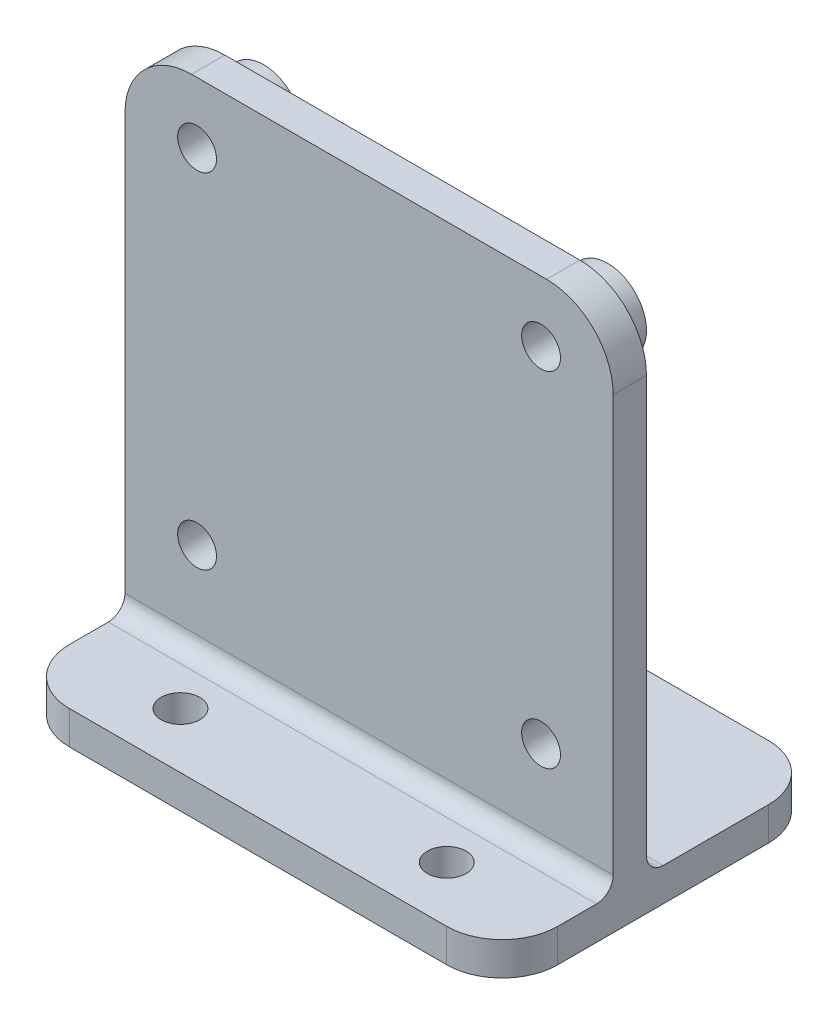
ISO-10303-21;
HEADER;
FILE_DESCRIPTION(('STEP AP214'),'2;1');
FILE_NAME('part.step','',(''),(''),'','','');
FILE_SCHEMA(('AUTOMOTIVE_DESIGN { 1 0 10303 214 1 1 1 1 }'));
ENDSEC;
DATA;
#1=APPLICATION_CONTEXT('core data for automotive mechanical design processes');
#2=APPLICATION_PROTOCOL_DEFINITION('international standard','automotive_design',2000,#1);
#3=PRODUCT_CONTEXT('',#1,'mechanical');
#4=PRODUCT('Part','Part','',(#3));
#5=PRODUCT_RELATED_PRODUCT_CATEGORY('part','',(#4));
#6=PRODUCT_DEFINITION_FORMATION('','',#4);
#7=PRODUCT_DEFINITION_CONTEXT('part definition',#1,'design');
#8=PRODUCT_DEFINITION('design','',#6,#7);
#9=PRODUCT_DEFINITION_SHAPE('','',#8);
#10=(LENGTH_UNIT() NAMED_UNIT(*) SI_UNIT(.MILLI.,.METRE.));
#11=(NAMED_UNIT(*) PLANE_ANGLE_UNIT() SI_UNIT($,.RADIAN.));
#12=(NAMED_UNIT(*) SI_UNIT($,.STERADIAN.) SOLID_ANGLE_UNIT());
#13=UNCERTAINTY_MEASURE_WITH_UNIT(LENGTH_MEASURE(1.E-05),#10,'distance_accuracy_value','');
#14=(GEOMETRIC_REPRESENTATION_CONTEXT(3) GLOBAL_UNCERTAINTY_ASSIGNED_CONTEXT((#13)) GLOBAL_UNIT_ASSIGNED_CONTEXT((#10,
#11,#12)) REPRESENTATION_CONTEXT('',''));
#15=CARTESIAN_POINT('',(0.,0.,0.));
#16=DIRECTION('',(0.,0.,1.));
#17=DIRECTION('',(1.,0.,0.));
#18=AXIS2_PLACEMENT_3D('',#15,#16,#17);
#19=CARTESIAN_POINT('',(22.,48.,-1.5));
#20=DIRECTION('',(0.,0.,1.));
#21=DIRECTION('',(0.,-1.,0.));
#22=AXIS2_PLACEMENT_3D('',#19,#20,#21);
#23=PLANE('',#22);
#24=CARTESIAN_POINT('',(-15.5,42.5,-1.5));
#25=DIRECTION('',(0.,0.,1.));
#26=DIRECTION('',(0.,1.,0.));
#27=AXIS2_PLACEMENT_3D('',#24,#25,#26);
#28=CIRCLE('',#27,3.5);
#29=CARTESIAN_POINT('',(-15.5,46.,-1.5));
#30=VERTEX_POINT('',#29);
#31=EDGE_CURVE('E479',#30,#30,#28,.T.);
#32=ORIENTED_EDGE('',*,*,#31,.T.);
#33=EDGE_LOOP('',(#32));
#34=FACE_BOUND('',#33,.T.);
#35=CARTESIAN_POINT('',(-15.5,11.5,-1.5));
#36=DIRECTION('',(0.,0.,1.));
#37=DIRECTION('',(0.,1.,0.));
#38=AXIS2_PLACEMENT_3D('',#35,#36,#37);
#39=CIRCLE('',#38,3.5);
#40=CARTESIAN_POINT('',(-15.5,15.,-1.5));
#41=VERTEX_POINT('',#40);
#42=EDGE_CURVE('E491',#41,#41,#39,.T.);
#43=ORIENTED_EDGE('',*,*,#42,.T.);
#44=EDGE_LOOP('',(#43));
#45=FACE_BOUND('',#44,.T.);
#46=CARTESIAN_POINT('',(15.5,11.5,-1.5));
#47=DIRECTION('',(0.,0.,1.));
#48=DIRECTION('',(0.,-1.,0.));
#49=AXIS2_PLACEMENT_3D('',#46,#47,#48);
#50=CIRCLE('',#49,3.5);
#51=CARTESIAN_POINT('',(15.5,8.,-1.5));
#52=VERTEX_POINT('',#51);
#53=EDGE_CURVE('E54',#52,#52,#50,.F.);
#54=ORIENTED_EDGE('',*,*,#53,.F.);
#55=EDGE_LOOP('',(#54));
#56=FACE_BOUND('',#55,.T.);
#57=DIRECTION('',(0.,1.,0.));
#58=VECTOR('',#57,1.);
#59=CARTESIAN_POINT('',(22.,48.,-1.5));
#60=LINE('',#59,#58);
#61=CARTESIAN_POINT('',(22.,4.50000000000001,-1.5));
#62=VERTEX_POINT('',#61);
#63=CARTESIAN_POINT('',(22.,42.,-1.5));
#64=VERTEX_POINT('',#63);
#65=EDGE_CURVE('E272',#62,#64,#60,.T.);
#66=ORIENTED_EDGE('',*,*,#65,.F.);
#67=DIRECTION('',(-1.,0.,0.));
#68=VECTOR('',#67,1.);
#69=CARTESIAN_POINT('',(-22.,4.5,-1.5));
#70=LINE('',#69,#68);
#71=CARTESIAN_POINT('',(-22.,4.50000000000001,-1.5));
#72=VERTEX_POINT('',#71);
#73=EDGE_CURVE('E253',#62,#72,#70,.T.);
#74=ORIENTED_EDGE('',*,*,#73,.T.);
#75=DIRECTION('',(0.,1.,0.));
#76=VECTOR('',#75,1.);
#77=CARTESIAN_POINT('',(-22.,48.,-1.5));
#78=LINE('',#77,#76);
#79=CARTESIAN_POINT('',(-22.,42.,-1.5));
#80=VERTEX_POINT('',#79);
#81=EDGE_CURVE('E397',#72,#80,#78,.T.);
#82=ORIENTED_EDGE('',*,*,#81,.T.);
#83=CARTESIAN_POINT('',(-16.,42.,-1.5));
#84=DIRECTION('',(0.,0.,1.));
#85=DIRECTION('',(0.,-1.,0.));
#86=AXIS2_PLACEMENT_3D('',#83,#84,#85);
#87=CIRCLE('',#86,6.);
#88=CARTESIAN_POINT('',(-16.,48.,-1.5));
#89=VERTEX_POINT('',#88);
#90=EDGE_CURVE('E204',#80,#89,#87,.F.);
#91=ORIENTED_EDGE('',*,*,#90,.T.);
#92=DIRECTION('',(-1.,0.,0.));
#93=VECTOR('',#92,1.);
#94=CARTESIAN_POINT('',(22.,48.,-1.5));
#95=LINE('',#94,#93);
#96=CARTESIAN_POINT('',(16.,48.,-1.5));
#97=VERTEX_POINT('',#96);
#98=EDGE_CURVE('E181',#97,#89,#95,.T.);
#99=ORIENTED_EDGE('',*,*,#98,.F.);
#100=CARTESIAN_POINT('',(16.,42.,-1.5));
#101=DIRECTION('',(0.,0.,1.));
#102=DIRECTION('',(0.,-1.,0.));
#103=AXIS2_PLACEMENT_3D('',#100,#101,#102);
#104=CIRCLE('',#103,6.);
#105=EDGE_CURVE('E186',#97,#64,#104,.F.);
#106=ORIENTED_EDGE('',*,*,#105,.T.);
#107=EDGE_LOOP('',(#66,#74,#82,#91,#99,#106));
#108=FACE_BOUND('',#107,.T.);
#109=CARTESIAN_POINT('',(15.5,42.5,-1.5));
#110=DIRECTION('',(0.,0.,1.));
#111=DIRECTION('',(0.,-1.,0.));
#112=AXIS2_PLACEMENT_3D('',#109,#110,#111);
#113=CIRCLE('',#112,3.5);
#114=CARTESIAN_POINT('',(15.5,39.,-1.5));
#115=VERTEX_POINT('',#114);
#116=EDGE_CURVE('E11',#115,#115,#113,.F.);
#117=ORIENTED_EDGE('',*,*,#116,.F.);
#118=EDGE_LOOP('',(#117));
#119=FACE_BOUND('',#118,.T.);
#120=ADVANCED_FACE('F50',(#34,#45,#56,#108,#119),#23,.F.);
#121=CARTESIAN_POINT('',(22.,3.,-17.5));
#122=DIRECTION('',(0.,0.,1.));
#123=DIRECTION('',(1.,0.,0.));
#124=AXIS2_PLACEMENT_3D('',#121,#122,#123);
#125=PLANE('',#124);
#126=DIRECTION('',(-1.,0.,0.));
#127=VECTOR('',#126,1.);
#128=CARTESIAN_POINT('',(22.,3.,-17.5));
#129=LINE('',#128,#127);
#130=CARTESIAN_POINT('',(17.,3.,-17.5));
#131=VERTEX_POINT('',#130);
#132=CARTESIAN_POINT('',(-17.,3.,-17.5));
#133=VERTEX_POINT('',#132);
#134=EDGE_CURVE('E188',#131,#133,#129,.T.);
#135=ORIENTED_EDGE('',*,*,#134,.F.);
#136=DIRECTION('',(0.,1.,0.));
#137=VECTOR('',#136,1.);
#138=CARTESIAN_POINT('',(17.,0.,-17.5));
#139=LINE('',#138,#137);
#140=CARTESIAN_POINT('',(17.,0.,-17.5));
#141=VERTEX_POINT('',#140);
#142=EDGE_CURVE('E222',#131,#141,#139,.F.);
#143=ORIENTED_EDGE('',*,*,#142,.T.);
#144=DIRECTION('',(-1.,0.,0.));
#145=VECTOR('',#144,1.);
#146=CARTESIAN_POINT('',(22.,0.,-17.5));
#147=LINE('',#146,#145);
#148=CARTESIAN_POINT('',(-17.,0.,-17.5));
#149=VERTEX_POINT('',#148);
#150=EDGE_CURVE('E395',#141,#149,#147,.T.);
#151=ORIENTED_EDGE('',*,*,#150,.T.);
#152=DIRECTION('',(0.,1.,0.));
#153=VECTOR('',#152,1.);
#154=CARTESIAN_POINT('',(-17.,3.,-17.5));
#155=LINE('',#154,#153);
#156=EDGE_CURVE('E217',#149,#133,#155,.T.);
#157=ORIENTED_EDGE('',*,*,#156,.T.);
#158=EDGE_LOOP('',(#135,#143,#151,#157));
#159=FACE_BOUND('',#158,.T.);
#160=ADVANCED_FACE('F268',(#159),#125,.F.);
#161=CARTESIAN_POINT('',(22.,3.,-1.5));
#162=DIRECTION('',(0.,-1.,0.));
#163=DIRECTION('',(0.,0.,-1.));
#164=AXIS2_PLACEMENT_3D('',#161,#162,#163);
#165=PLANE('',#164);
#166=DIRECTION('',(0.,0.,1.));
#167=VECTOR('',#166,1.);
#168=CARTESIAN_POINT('',(-22.,3.,-1.5));
#169=LINE('',#168,#167);
#170=CARTESIAN_POINT('',(-22.,3.,-12.5));
#171=VERTEX_POINT('',#170);
#172=CARTESIAN_POINT('',(-22.,3.,-3.));
#173=VERTEX_POINT('',#172);
#174=EDGE_CURVE('E396',#171,#173,#169,.T.);
#175=ORIENTED_EDGE('',*,*,#174,.T.);
#176=DIRECTION('',(-1.,0.,0.));
#177=VECTOR('',#176,1.);
#178=CARTESIAN_POINT('',(22.,3.,-3.));
#179=LINE('',#178,#177);
#180=CARTESIAN_POINT('',(22.,3.,-3.));
#181=VERTEX_POINT('',#180);
#182=EDGE_CURVE('E69',#173,#181,#179,.F.);
#183=ORIENTED_EDGE('',*,*,#182,.T.);
#184=DIRECTION('',(0.,0.,1.));
#185=VECTOR('',#184,1.);
#186=CARTESIAN_POINT('',(22.,3.,-1.5));
#187=LINE('',#186,#185);
#188=CARTESIAN_POINT('',(22.,3.,-12.5));
#189=VERTEX_POINT('',#188);
#190=EDGE_CURVE('E408',#189,#181,#187,.T.);
#191=ORIENTED_EDGE('',*,*,#190,.F.);
#192=CARTESIAN_POINT('',(17.,3.,-12.5));
#193=DIRECTION('',(0.,-1.,0.));
#194=DIRECTION('',(0.,0.,-1.));
#195=AXIS2_PLACEMENT_3D('',#192,#193,#194);
#196=CIRCLE('',#195,5.);
#197=EDGE_CURVE('E216',#189,#131,#196,.F.);
#198=ORIENTED_EDGE('',*,*,#197,.T.);
#199=ORIENTED_EDGE('',*,*,#134,.T.);
#200=CARTESIAN_POINT('',(-17.,3.,-12.5));
#201=DIRECTION('',(0.,-1.,0.));
#202=DIRECTION('',(0.,0.,-1.));
#203=AXIS2_PLACEMENT_3D('',#200,#201,#202);
#204=CIRCLE('',#203,5.);
#205=EDGE_CURVE('E212',#133,#171,#204,.F.);
#206=ORIENTED_EDGE('',*,*,#205,.T.);
#207=EDGE_LOOP('',(#175,#183,#191,#198,#199,#206));
#208=FACE_BOUND('',#207,.T.);
#209=ADVANCED_FACE('F347',(#208),#165,.F.);
#210=CARTESIAN_POINT('',(22.,48.,1.5));
#211=DIRECTION('',(0.,-1.,0.));
#212=DIRECTION('',(0.,0.,-1.));
#213=AXIS2_PLACEMENT_3D('',#210,#211,#212);
#214=PLANE('',#213);
#215=ORIENTED_EDGE('',*,*,#98,.T.);
#216=DIRECTION('',(0.,0.,1.));
#217=VECTOR('',#216,1.);
#218=CARTESIAN_POINT('',(-16.,48.,1.5));
#219=LINE('',#218,#217);
#220=CARTESIAN_POINT('',(-16.,48.,1.5));
#221=VERTEX_POINT('',#220);
#222=EDGE_CURVE('E171',#89,#221,#219,.T.);
#223=ORIENTED_EDGE('',*,*,#222,.T.);
#224=DIRECTION('',(-1.,0.,0.));
#225=VECTOR('',#224,1.);
#226=CARTESIAN_POINT('',(22.,48.,1.5));
#227=LINE('',#226,#225);
#228=CARTESIAN_POINT('',(16.,48.,1.5));
#229=VERTEX_POINT('',#228);
#230=EDGE_CURVE('E167',#229,#221,#227,.T.);
#231=ORIENTED_EDGE('',*,*,#230,.F.);
#232=DIRECTION('',(0.,0.,1.));
#233=VECTOR('',#232,1.);
#234=CARTESIAN_POINT('',(16.,48.,-1.5));
#235=LINE('',#234,#233);
#236=EDGE_CURVE('E177',#229,#97,#235,.F.);
#237=ORIENTED_EDGE('',*,*,#236,.T.);
#238=EDGE_LOOP('',(#215,#223,#231,#237));
#239=FACE_BOUND('',#238,.T.);
#240=ADVANCED_FACE('F179',(#239),#214,.F.);
#241=CARTESIAN_POINT('',(22.,3.,1.49999999999999));
#242=DIRECTION('',(0.,0.,-1.));
#243=DIRECTION('',(0.,1.,0.));
#244=AXIS2_PLACEMENT_3D('',#241,#242,#243);
#245=PLANE('',#244);
#246=CARTESIAN_POINT('',(15.5,42.5,1.5));
#247=DIRECTION('',(0.,0.,-1.));
#248=DIRECTION('',(0.,1.,0.));
#249=AXIS2_PLACEMENT_3D('',#246,#247,#248);
#250=CIRCLE('',#249,1.75);
#251=CARTESIAN_POINT('',(15.5,44.25,1.5));
#252=VERTEX_POINT('',#251);
#253=EDGE_CURVE('E198',#252,#252,#250,.F.);
#254=ORIENTED_EDGE('',*,*,#253,.F.);
#255=EDGE_LOOP('',(#254));
#256=FACE_BOUND('',#255,.T.);
#257=CARTESIAN_POINT('',(-15.5,11.5,1.49999999999999));
#258=DIRECTION('',(0.,0.,-1.));
#259=DIRECTION('',(0.,1.,0.));
#260=AXIS2_PLACEMENT_3D('',#257,#258,#259);
#261=CIRCLE('',#260,1.75);
#262=CARTESIAN_POINT('',(-15.5,13.25,1.49999999999999));
#263=VERTEX_POINT('',#262);
#264=EDGE_CURVE('E421',#263,#263,#261,.F.);
#265=ORIENTED_EDGE('',*,*,#264,.F.);
#266=EDGE_LOOP('',(#265));
#267=FACE_BOUND('',#266,.T.);
#268=CARTESIAN_POINT('',(-15.5,42.5,1.5));
#269=DIRECTION('',(0.,0.,-1.));
#270=DIRECTION('',(0.,1.,0.));
#271=AXIS2_PLACEMENT_3D('',#268,#269,#270);
#272=CIRCLE('',#271,1.75);
#273=CARTESIAN_POINT('',(-15.5,44.25,1.5));
#274=VERTEX_POINT('',#273);
#275=EDGE_CURVE('E402',#274,#274,#272,.T.);
#276=ORIENTED_EDGE('',*,*,#275,.T.);
#277=EDGE_LOOP('',(#276));
#278=FACE_BOUND('',#277,.T.);
#279=CARTESIAN_POINT('',(15.5,11.5,1.49999999999999));
#280=DIRECTION('',(0.,0.,-1.));
#281=DIRECTION('',(0.,1.,0.));
#282=AXIS2_PLACEMENT_3D('',#279,#280,#281);
#283=CIRCLE('',#282,1.75);
#284=CARTESIAN_POINT('',(15.5,13.25,1.49999999999999));
#285=VERTEX_POINT('',#284);
#286=EDGE_CURVE('E420',#285,#285,#283,.T.);
#287=ORIENTED_EDGE('',*,*,#286,.T.);
#288=EDGE_LOOP('',(#287));
#289=FACE_BOUND('',#288,.T.);
#290=DIRECTION('',(0.,-1.,0.));
#291=VECTOR('',#290,1.);
#292=CARTESIAN_POINT('',(-22.,3.,1.49999999999999));
#293=LINE('',#292,#291);
#294=CARTESIAN_POINT('',(-22.,42.,1.5));
#295=VERTEX_POINT('',#294);
#296=CARTESIAN_POINT('',(-22.,4.5,1.49999999999999));
#297=VERTEX_POINT('',#296);
#298=EDGE_CURVE('E401',#295,#297,#293,.T.);
#299=ORIENTED_EDGE('',*,*,#298,.T.);
#300=DIRECTION('',(-1.,0.,0.));
#301=VECTOR('',#300,1.);
#302=CARTESIAN_POINT('',(22.,4.5,1.49999999999999));
#303=LINE('',#302,#301);
#304=CARTESIAN_POINT('',(22.,4.5,1.49999999999999));
#305=VERTEX_POINT('',#304);
#306=EDGE_CURVE('E249',#297,#305,#303,.F.);
#307=ORIENTED_EDGE('',*,*,#306,.T.);
#308=DIRECTION('',(0.,-1.,0.));
#309=VECTOR('',#308,1.);
#310=CARTESIAN_POINT('',(22.,3.,1.49999999999999));
#311=LINE('',#310,#309);
#312=CARTESIAN_POINT('',(22.,42.,1.5));
#313=VERTEX_POINT('',#312);
#314=EDGE_CURVE('E169',#313,#305,#311,.T.);
#315=ORIENTED_EDGE('',*,*,#314,.F.);
#316=CARTESIAN_POINT('',(16.,42.,1.5));
#317=DIRECTION('',(0.,0.,-1.));
#318=DIRECTION('',(0.,1.,0.));
#319=AXIS2_PLACEMENT_3D('',#316,#317,#318);
#320=CIRCLE('',#319,6.);
#321=EDGE_CURVE('E165',#313,#229,#320,.F.);
#322=ORIENTED_EDGE('',*,*,#321,.T.);
#323=ORIENTED_EDGE('',*,*,#230,.T.);
#324=CARTESIAN_POINT('',(-16.,42.,1.5));
#325=DIRECTION('',(0.,0.,-1.));
#326=DIRECTION('',(0.,1.,0.));
#327=AXIS2_PLACEMENT_3D('',#324,#325,#326);
#328=CIRCLE('',#327,6.);
#329=EDGE_CURVE('E175',#221,#295,#328,.F.);
#330=ORIENTED_EDGE('',*,*,#329,.T.);
#331=EDGE_LOOP('',(#299,#307,#315,#322,#323,#330));
#332=FACE_BOUND('',#331,.T.);
#333=ADVANCED_FACE('F164',(#256,#267,#278,#289,#332),#245,.F.);
#334=CARTESIAN_POINT('',(22.,3.,11.5));
#335=DIRECTION('',(0.,-1.,0.));
#336=DIRECTION('',(0.,0.,-1.));
#337=AXIS2_PLACEMENT_3D('',#334,#335,#336);
#338=PLANE('',#337);
#339=CARTESIAN_POINT('',(-12.,3.,6.5));
#340=DIRECTION('',(0.,1.,0.));
#341=DIRECTION('',(0.,0.,1.));
#342=AXIS2_PLACEMENT_3D('',#339,#340,#341);
#343=CIRCLE('',#342,1.75);
#344=CARTESIAN_POINT('',(-12.,3.,8.25));
#345=VERTEX_POINT('',#344);
#346=EDGE_CURVE('E427',#345,#345,#343,.T.);
#347=ORIENTED_EDGE('',*,*,#346,.F.);
#348=EDGE_LOOP('',(#347));
#349=FACE_BOUND('',#348,.T.);
#350=CARTESIAN_POINT('',(12.,3.,6.5));
#351=DIRECTION('',(0.,1.,0.));
#352=DIRECTION('',(0.,0.,1.));
#353=AXIS2_PLACEMENT_3D('',#350,#351,#352);
#354=CIRCLE('',#353,1.75);
#355=CARTESIAN_POINT('',(12.,3.,8.25));
#356=VERTEX_POINT('',#355);
#357=EDGE_CURVE('E433',#356,#356,#354,.T.);
#358=ORIENTED_EDGE('',*,*,#357,.F.);
#359=EDGE_LOOP('',(#358));
#360=FACE_BOUND('',#359,.T.);
#361=DIRECTION('',(0.,0.,1.));
#362=VECTOR('',#361,1.);
#363=CARTESIAN_POINT('',(22.,3.,11.5));
#364=LINE('',#363,#362);
#365=CARTESIAN_POINT('',(22.,3.,2.99999999999999));
#366=VERTEX_POINT('',#365);
#367=CARTESIAN_POINT('',(22.,3.,6.5));
#368=VERTEX_POINT('',#367);
#369=EDGE_CURVE('E384',#366,#368,#364,.T.);
#370=ORIENTED_EDGE('',*,*,#369,.F.);
#371=DIRECTION('',(-1.,0.,0.));
#372=VECTOR('',#371,1.);
#373=CARTESIAN_POINT('',(-22.,3.,2.99999999999999));
#374=LINE('',#373,#372);
#375=CARTESIAN_POINT('',(-22.,3.,2.99999999999999));
#376=VERTEX_POINT('',#375);
#377=EDGE_CURVE('E248',#366,#376,#374,.T.);
#378=ORIENTED_EDGE('',*,*,#377,.T.);
#379=DIRECTION('',(0.,0.,1.));
#380=VECTOR('',#379,1.);
#381=CARTESIAN_POINT('',(-22.,3.,11.5));
#382=LINE('',#381,#380);
#383=CARTESIAN_POINT('',(-22.,3.,6.5));
#384=VERTEX_POINT('',#383);
#385=EDGE_CURVE('E403',#376,#384,#382,.T.);
#386=ORIENTED_EDGE('',*,*,#385,.T.);
#387=CARTESIAN_POINT('',(-17.,3.,6.5));
#388=DIRECTION('',(0.,-1.,0.));
#389=DIRECTION('',(0.,0.,-1.));
#390=AXIS2_PLACEMENT_3D('',#387,#388,#389);
#391=CIRCLE('',#390,5.);
#392=CARTESIAN_POINT('',(-17.,3.,11.5));
#393=VERTEX_POINT('',#392);
#394=EDGE_CURVE('E241',#384,#393,#391,.F.);
#395=ORIENTED_EDGE('',*,*,#394,.T.);
#396=DIRECTION('',(-1.,0.,0.));
#397=VECTOR('',#396,1.);
#398=CARTESIAN_POINT('',(22.,3.,11.5));
#399=LINE('',#398,#397);
#400=CARTESIAN_POINT('',(17.,3.,11.5));
#401=VERTEX_POINT('',#400);
#402=EDGE_CURVE('E184',#401,#393,#399,.T.);
#403=ORIENTED_EDGE('',*,*,#402,.F.);
#404=CARTESIAN_POINT('',(17.,3.,6.5));
#405=DIRECTION('',(0.,-1.,0.));
#406=DIRECTION('',(0.,0.,-1.));
#407=AXIS2_PLACEMENT_3D('',#404,#405,#406);
#408=CIRCLE('',#407,5.);
#409=EDGE_CURVE('E242',#401,#368,#408,.F.);
#410=ORIENTED_EDGE('',*,*,#409,.T.);
#411=EDGE_LOOP('',(#370,#378,#386,#395,#403,#410));
#412=FACE_BOUND('',#411,.T.);
#413=ADVANCED_FACE('F339',(#349,#360,#412),#338,.F.);
#414=CARTESIAN_POINT('',(22.,0.,11.5));
#415=DIRECTION('',(0.,0.,-1.));
#416=DIRECTION('',(-1.,0.,0.));
#417=AXIS2_PLACEMENT_3D('',#414,#415,#416);
#418=PLANE('',#417);
#419=ORIENTED_EDGE('',*,*,#402,.T.);
#420=DIRECTION('',(0.,-1.,0.));
#421=VECTOR('',#420,1.);
#422=CARTESIAN_POINT('',(-17.,0.,11.5));
#423=LINE('',#422,#421);
#424=CARTESIAN_POINT('',(-17.,0.,11.5));
#425=VERTEX_POINT('',#424);
#426=EDGE_CURVE('E236',#393,#425,#423,.T.);
#427=ORIENTED_EDGE('',*,*,#426,.T.);
#428=DIRECTION('',(-1.,0.,0.));
#429=VECTOR('',#428,1.);
#430=CARTESIAN_POINT('',(22.,0.,11.5));
#431=LINE('',#430,#429);
#432=CARTESIAN_POINT('',(17.,0.,11.5));
#433=VERTEX_POINT('',#432);
#434=EDGE_CURVE('E411',#433,#425,#431,.T.);
#435=ORIENTED_EDGE('',*,*,#434,.F.);
#436=DIRECTION('',(0.,-1.,0.));
#437=VECTOR('',#436,1.);
#438=CARTESIAN_POINT('',(17.,3.,11.5));
#439=LINE('',#438,#437);
#440=EDGE_CURVE('E237',#433,#401,#439,.F.);
#441=ORIENTED_EDGE('',*,*,#440,.T.);
#442=EDGE_LOOP('',(#419,#427,#435,#441));
#443=FACE_BOUND('',#442,.T.);
#444=ADVANCED_FACE('F334',(#443),#418,.F.);
#445=CARTESIAN_POINT('',(22.,0.,0.));
#446=DIRECTION('',(0.,1.,0.));
#447=DIRECTION('',(0.,0.,1.));
#448=AXIS2_PLACEMENT_3D('',#445,#446,#447);
#449=PLANE('',#448);
#450=CARTESIAN_POINT('',(-12.,0.,6.5));
#451=DIRECTION('',(0.,1.,0.));
#452=DIRECTION('',(0.,0.,1.));
#453=AXIS2_PLACEMENT_3D('',#450,#451,#452);
#454=CIRCLE('',#453,1.75);
#455=CARTESIAN_POINT('',(-12.,0.,8.25));
#456=VERTEX_POINT('',#455);
#457=EDGE_CURVE('E422',#456,#456,#454,.T.);
#458=ORIENTED_EDGE('',*,*,#457,.T.);
#459=EDGE_LOOP('',(#458));
#460=FACE_BOUND('',#459,.T.);
#461=CARTESIAN_POINT('',(12.,0.,6.5));
#462=DIRECTION('',(0.,1.,0.));
#463=DIRECTION('',(0.,0.,1.));
#464=AXIS2_PLACEMENT_3D('',#461,#462,#463);
#465=CIRCLE('',#464,1.75);
#466=CARTESIAN_POINT('',(12.,0.,8.25));
#467=VERTEX_POINT('',#466);
#468=EDGE_CURVE('E442',#467,#467,#465,.T.);
#469=ORIENTED_EDGE('',*,*,#468,.T.);
#470=EDGE_LOOP('',(#469));
#471=FACE_BOUND('',#470,.T.);
#472=ORIENTED_EDGE('',*,*,#150,.F.);
#473=CARTESIAN_POINT('',(17.,0.,-12.5));
#474=DIRECTION('',(0.,1.,0.));
#475=DIRECTION('',(0.,0.,1.));
#476=AXIS2_PLACEMENT_3D('',#473,#474,#475);
#477=CIRCLE('',#476,5.);
#478=CARTESIAN_POINT('',(22.,0.,-12.5));
#479=VERTEX_POINT('',#478);
#480=EDGE_CURVE('E226',#141,#479,#477,.F.);
#481=ORIENTED_EDGE('',*,*,#480,.T.);
#482=DIRECTION('',(0.,0.,-1.));
#483=VECTOR('',#482,1.);
#484=CARTESIAN_POINT('',(22.,0.,0.));
#485=LINE('',#484,#483);
#486=CARTESIAN_POINT('',(22.,0.,6.5));
#487=VERTEX_POINT('',#486);
#488=EDGE_CURVE('E392',#487,#479,#485,.T.);
#489=ORIENTED_EDGE('',*,*,#488,.F.);
#490=CARTESIAN_POINT('',(17.,0.,6.5));
#491=DIRECTION('',(0.,1.,0.));
#492=DIRECTION('',(0.,0.,1.));
#493=AXIS2_PLACEMENT_3D('',#490,#491,#492);
#494=CIRCLE('',#493,5.);
#495=EDGE_CURVE('E224',#487,#433,#494,.F.);
#496=ORIENTED_EDGE('',*,*,#495,.T.);
#497=ORIENTED_EDGE('',*,*,#434,.T.);
#498=CARTESIAN_POINT('',(-17.,0.,6.5));
#499=DIRECTION('',(0.,1.,0.));
#500=DIRECTION('',(0.,0.,1.));
#501=AXIS2_PLACEMENT_3D('',#498,#499,#500);
#502=CIRCLE('',#501,5.);
#503=CARTESIAN_POINT('',(-22.,0.,6.5));
#504=VERTEX_POINT('',#503);
#505=EDGE_CURVE('E223',#425,#504,#502,.F.);
#506=ORIENTED_EDGE('',*,*,#505,.T.);
#507=DIRECTION('',(0.,0.,-1.));
#508=VECTOR('',#507,1.);
#509=CARTESIAN_POINT('',(-22.,0.,0.));
#510=LINE('',#509,#508);
#511=CARTESIAN_POINT('',(-22.,0.,-12.5));
#512=VERTEX_POINT('',#511);
#513=EDGE_CURVE('E409',#504,#512,#510,.T.);
#514=ORIENTED_EDGE('',*,*,#513,.T.);
#515=CARTESIAN_POINT('',(-17.,0.,-12.5));
#516=DIRECTION('',(0.,1.,0.));
#517=DIRECTION('',(0.,0.,1.));
#518=AXIS2_PLACEMENT_3D('',#515,#516,#517);
#519=CIRCLE('',#518,5.);
#520=EDGE_CURVE('E229',#512,#149,#519,.F.);
#521=ORIENTED_EDGE('',*,*,#520,.T.);
#522=EDGE_LOOP('',(#472,#481,#489,#496,#497,#506,#514,#521));
#523=FACE_BOUND('',#522,.T.);
#524=ADVANCED_FACE('F330',(#460,#471,#523),#449,.F.);
#525=CARTESIAN_POINT('',(22.,0.,0.));
#526=DIRECTION('',(1.,0.,0.));
#527=DIRECTION('',(0.,0.,-1.));
#528=AXIS2_PLACEMENT_3D('',#525,#526,#527);
#529=PLANE('',#528);
#530=ORIENTED_EDGE('',*,*,#488,.T.);
#531=DIRECTION('',(0.,1.,0.));
#532=VECTOR('',#531,1.);
#533=CARTESIAN_POINT('',(22.,3.,-12.5));
#534=LINE('',#533,#532);
#535=EDGE_CURVE('E211',#479,#189,#534,.T.);
#536=ORIENTED_EDGE('',*,*,#535,.T.);
#537=ORIENTED_EDGE('',*,*,#190,.T.);
#538=CARTESIAN_POINT('',(22.,4.5,-3.));
#539=DIRECTION('',(1.,0.,0.));
#540=DIRECTION('',(0.,0.,-1.));
#541=AXIS2_PLACEMENT_3D('',#538,#539,#540);
#542=CIRCLE('',#541,1.5);
#543=EDGE_CURVE('E257',#181,#62,#542,.F.);
#544=ORIENTED_EDGE('',*,*,#543,.T.);
#545=ORIENTED_EDGE('',*,*,#65,.T.);
#546=DIRECTION('',(0.,0.,1.));
#547=VECTOR('',#546,1.);
#548=CARTESIAN_POINT('',(22.,42.,1.5));
#549=LINE('',#548,#547);
#550=EDGE_CURVE('E206',#64,#313,#549,.T.);
#551=ORIENTED_EDGE('',*,*,#550,.T.);
#552=ORIENTED_EDGE('',*,*,#314,.T.);
#553=CARTESIAN_POINT('',(22.,4.5,2.99999999999999));
#554=DIRECTION('',(1.,0.,0.));
#555=DIRECTION('',(0.,0.,-1.));
#556=AXIS2_PLACEMENT_3D('',#553,#554,#555);
#557=CIRCLE('',#556,1.5);
#558=EDGE_CURVE('E260',#305,#366,#557,.F.);
#559=ORIENTED_EDGE('',*,*,#558,.T.);
#560=ORIENTED_EDGE('',*,*,#369,.T.);
#561=DIRECTION('',(0.,-1.,0.));
#562=VECTOR('',#561,1.);
#563=CARTESIAN_POINT('',(22.,0.,6.5));
#564=LINE('',#563,#562);
#565=EDGE_CURVE('E208',#368,#487,#564,.T.);
#566=ORIENTED_EDGE('',*,*,#565,.T.);
#567=EDGE_LOOP('',(#530,#536,#537,#544,#545,#551,#552,#559,#560,#566));
#568=FACE_BOUND('',#567,.T.);
#569=ADVANCED_FACE('F322',(#568),#529,.T.);
#570=CARTESIAN_POINT('',(-22.,0.,0.));
#571=DIRECTION('',(1.,0.,0.));
#572=DIRECTION('',(0.,0.,-1.));
#573=AXIS2_PLACEMENT_3D('',#570,#571,#572);
#574=PLANE('',#573);
#575=ORIENTED_EDGE('',*,*,#174,.F.);
#576=DIRECTION('',(0.,1.,0.));
#577=VECTOR('',#576,1.);
#578=CARTESIAN_POINT('',(-22.,0.,-12.5));
#579=LINE('',#578,#577);
#580=EDGE_CURVE('E234',#171,#512,#579,.F.);
#581=ORIENTED_EDGE('',*,*,#580,.T.);
#582=ORIENTED_EDGE('',*,*,#513,.F.);
#583=DIRECTION('',(0.,-1.,0.));
#584=VECTOR('',#583,1.);
#585=CARTESIAN_POINT('',(-22.,0.,6.5));
#586=LINE('',#585,#584);
#587=EDGE_CURVE('E233',#504,#384,#586,.F.);
#588=ORIENTED_EDGE('',*,*,#587,.T.);
#589=ORIENTED_EDGE('',*,*,#385,.F.);
#590=CARTESIAN_POINT('',(-22.,4.5,2.99999999999999));
#591=DIRECTION('',(1.,0.,0.));
#592=DIRECTION('',(0.,0.,-1.));
#593=AXIS2_PLACEMENT_3D('',#590,#591,#592);
#594=CIRCLE('',#593,1.5);
#595=EDGE_CURVE('E254',#376,#297,#594,.T.);
#596=ORIENTED_EDGE('',*,*,#595,.T.);
#597=ORIENTED_EDGE('',*,*,#298,.F.);
#598=DIRECTION('',(0.,0.,1.));
#599=VECTOR('',#598,1.);
#600=CARTESIAN_POINT('',(-22.,42.,0.));
#601=LINE('',#600,#599);
#602=EDGE_CURVE('E199',#295,#80,#601,.F.);
#603=ORIENTED_EDGE('',*,*,#602,.T.);
#604=ORIENTED_EDGE('',*,*,#81,.F.);
#605=CARTESIAN_POINT('',(-22.,4.5,-3.));
#606=DIRECTION('',(1.,0.,0.));
#607=DIRECTION('',(0.,0.,-1.));
#608=AXIS2_PLACEMENT_3D('',#605,#606,#607);
#609=CIRCLE('',#608,1.5);
#610=EDGE_CURVE('E64',#72,#173,#609,.T.);
#611=ORIENTED_EDGE('',*,*,#610,.T.);
#612=EDGE_LOOP('',(#575,#581,#582,#588,#589,#596,#597,#603,#604,#611));
#613=FACE_BOUND('',#612,.T.);
#614=ADVANCED_FACE('F325',(#613),#574,.F.);
#615=CARTESIAN_POINT('',(15.5,11.5,11.5));
#616=DIRECTION('',(0.,0.,-1.));
#617=DIRECTION('',(0.,1.,0.));
#618=AXIS2_PLACEMENT_3D('',#615,#616,#617);
#619=CYLINDRICAL_SURFACE('',#618,1.75);
#620=ORIENTED_EDGE('',*,*,#286,.F.);
#621=EDGE_LOOP('',(#620));
#622=FACE_BOUND('',#621,.T.);
#623=CARTESIAN_POINT('',(15.5,11.5,-4.5));
#624=DIRECTION('',(0.,0.,-1.));
#625=DIRECTION('',(0.,1.,0.));
#626=AXIS2_PLACEMENT_3D('',#623,#624,#625);
#627=CIRCLE('',#626,1.75);
#628=CARTESIAN_POINT('',(15.5,13.25,-4.5));
#629=VERTEX_POINT('',#628);
#630=EDGE_CURVE('E436',#629,#629,#627,.T.);
#631=ORIENTED_EDGE('',*,*,#630,.T.);
#632=EDGE_LOOP('',(#631));
#633=FACE_BOUND('',#632,.T.);
#634=ADVANCED_FACE('F318',(#622,#633),#619,.F.);
#635=CARTESIAN_POINT('',(-15.5,42.5,11.5));
#636=DIRECTION('',(0.,0.,-1.));
#637=DIRECTION('',(0.,1.,0.));
#638=AXIS2_PLACEMENT_3D('',#635,#636,#637);
#639=CYLINDRICAL_SURFACE('',#638,1.75);
#640=ORIENTED_EDGE('',*,*,#275,.F.);
#641=EDGE_LOOP('',(#640));
#642=FACE_BOUND('',#641,.T.);
#643=CARTESIAN_POINT('',(-15.5,42.5,-4.5));
#644=DIRECTION('',(0.,0.,1.));
#645=DIRECTION('',(0.,1.,0.));
#646=AXIS2_PLACEMENT_3D('',#643,#644,#645);
#647=CIRCLE('',#646,1.75);
#648=CARTESIAN_POINT('',(-15.5,44.25,-4.5));
#649=VERTEX_POINT('',#648);
#650=EDGE_CURVE('E482',#649,#649,#647,.T.);
#651=ORIENTED_EDGE('',*,*,#650,.F.);
#652=EDGE_LOOP('',(#651));
#653=FACE_BOUND('',#652,.T.);
#654=ADVANCED_FACE('F314',(#642,#653),#639,.F.);
#655=CARTESIAN_POINT('',(-15.5,11.5,11.5));
#656=DIRECTION('',(0.,0.,-1.));
#657=DIRECTION('',(0.,1.,0.));
#658=AXIS2_PLACEMENT_3D('',#655,#656,#657);
#659=CYLINDRICAL_SURFACE('',#658,1.75);
#660=ORIENTED_EDGE('',*,*,#264,.T.);
#661=EDGE_LOOP('',(#660));
#662=FACE_BOUND('',#661,.T.);
#663=CARTESIAN_POINT('',(-15.5,11.5,-4.5));
#664=DIRECTION('',(0.,0.,1.));
#665=DIRECTION('',(0.,1.,0.));
#666=AXIS2_PLACEMENT_3D('',#663,#664,#665);
#667=CIRCLE('',#666,1.75);
#668=CARTESIAN_POINT('',(-15.5,13.25,-4.5));
#669=VERTEX_POINT('',#668);
#670=EDGE_CURVE('E488',#669,#669,#667,.T.);
#671=ORIENTED_EDGE('',*,*,#670,.F.);
#672=EDGE_LOOP('',(#671));
#673=FACE_BOUND('',#672,.T.);
#674=ADVANCED_FACE('F309',(#662,#673),#659,.F.);
#675=CARTESIAN_POINT('',(15.5,42.5,11.5));
#676=DIRECTION('',(0.,0.,-1.));
#677=DIRECTION('',(0.,1.,0.));
#678=AXIS2_PLACEMENT_3D('',#675,#676,#677);
#679=CYLINDRICAL_SURFACE('',#678,1.75);
#680=ORIENTED_EDGE('',*,*,#253,.T.);
#681=EDGE_LOOP('',(#680));
#682=FACE_BOUND('',#681,.T.);
#683=CARTESIAN_POINT('',(15.5,42.5,-4.5));
#684=DIRECTION('',(0.,0.,-1.));
#685=DIRECTION('',(0.,1.,0.));
#686=AXIS2_PLACEMENT_3D('',#683,#684,#685);
#687=CIRCLE('',#686,1.75);
#688=CARTESIAN_POINT('',(15.5,44.25,-4.5));
#689=VERTEX_POINT('',#688);
#690=EDGE_CURVE('E466',#689,#689,#687,.T.);
#691=ORIENTED_EDGE('',*,*,#690,.T.);
#692=EDGE_LOOP('',(#691));
#693=FACE_BOUND('',#692,.T.);
#694=ADVANCED_FACE('F308',(#682,#693),#679,.F.);
#695=CARTESIAN_POINT('',(12.,0.,6.5));
#696=DIRECTION('',(0.,1.,0.));
#697=DIRECTION('',(0.,0.,1.));
#698=AXIS2_PLACEMENT_3D('',#695,#696,#697);
#699=CYLINDRICAL_SURFACE('',#698,1.75);
#700=ORIENTED_EDGE('',*,*,#468,.F.);
#701=EDGE_LOOP('',(#700));
#702=FACE_BOUND('',#701,.T.);
#703=ORIENTED_EDGE('',*,*,#357,.T.);
#704=EDGE_LOOP('',(#703));
#705=FACE_BOUND('',#704,.T.);
#706=ADVANCED_FACE('F305',(#702,#705),#699,.F.);
#707=CARTESIAN_POINT('',(-12.,0.,6.5));
#708=DIRECTION('',(0.,1.,0.));
#709=DIRECTION('',(0.,0.,1.));
#710=AXIS2_PLACEMENT_3D('',#707,#708,#709);
#711=CYLINDRICAL_SURFACE('',#710,1.75);
#712=ORIENTED_EDGE('',*,*,#457,.F.);
#713=EDGE_LOOP('',(#712));
#714=FACE_BOUND('',#713,.T.);
#715=ORIENTED_EDGE('',*,*,#346,.T.);
#716=EDGE_LOOP('',(#715));
#717=FACE_BOUND('',#716,.T.);
#718=ADVANCED_FACE('F300',(#714,#717),#711,.F.);
#719=CARTESIAN_POINT('',(-16.,42.,1.5));
#720=DIRECTION('',(0.,0.,1.));
#721=DIRECTION('',(1.,0.,0.));
#722=AXIS2_PLACEMENT_3D('',#719,#720,#721);
#723=CYLINDRICAL_SURFACE('',#722,6.);
#724=ORIENTED_EDGE('',*,*,#90,.F.);
#725=ORIENTED_EDGE('',*,*,#602,.F.);
#726=ORIENTED_EDGE('',*,*,#329,.F.);
#727=ORIENTED_EDGE('',*,*,#222,.F.);
#728=EDGE_LOOP('',(#724,#725,#726,#727));
#729=FACE_BOUND('',#728,.T.);
#730=ADVANCED_FACE('F303',(#729),#723,.T.);
#731=CARTESIAN_POINT('',(16.,42.,0.));
#732=DIRECTION('',(0.,0.,-1.));
#733=DIRECTION('',(-1.,0.,0.));
#734=AXIS2_PLACEMENT_3D('',#731,#732,#733);
#735=CYLINDRICAL_SURFACE('',#734,6.);
#736=ORIENTED_EDGE('',*,*,#105,.F.);
#737=ORIENTED_EDGE('',*,*,#236,.F.);
#738=ORIENTED_EDGE('',*,*,#321,.F.);
#739=ORIENTED_EDGE('',*,*,#550,.F.);
#740=EDGE_LOOP('',(#736,#737,#738,#739));
#741=FACE_BOUND('',#740,.T.);
#742=ADVANCED_FACE('F189',(#741),#735,.T.);
#743=CARTESIAN_POINT('',(17.,0.,-12.5));
#744=DIRECTION('',(0.,-1.,0.));
#745=DIRECTION('',(0.,0.,-1.));
#746=AXIS2_PLACEMENT_3D('',#743,#744,#745);
#747=CYLINDRICAL_SURFACE('',#746,5.);
#748=ORIENTED_EDGE('',*,*,#480,.F.);
#749=ORIENTED_EDGE('',*,*,#142,.F.);
#750=ORIENTED_EDGE('',*,*,#197,.F.);
#751=ORIENTED_EDGE('',*,*,#535,.F.);
#752=EDGE_LOOP('',(#748,#749,#750,#751));
#753=FACE_BOUND('',#752,.T.);
#754=ADVANCED_FACE('F356',(#753),#747,.T.);
#755=CARTESIAN_POINT('',(-17.,3.,-12.5));
#756=DIRECTION('',(0.,1.,0.));
#757=DIRECTION('',(0.,0.,1.));
#758=AXIS2_PLACEMENT_3D('',#755,#756,#757);
#759=CYLINDRICAL_SURFACE('',#758,5.);
#760=ORIENTED_EDGE('',*,*,#520,.F.);
#761=ORIENTED_EDGE('',*,*,#580,.F.);
#762=ORIENTED_EDGE('',*,*,#205,.F.);
#763=ORIENTED_EDGE('',*,*,#156,.F.);
#764=EDGE_LOOP('',(#760,#761,#762,#763));
#765=FACE_BOUND('',#764,.T.);
#766=ADVANCED_FACE('F363',(#765),#759,.T.);
#767=CARTESIAN_POINT('',(-17.,0.,6.5));
#768=DIRECTION('',(0.,-1.,0.));
#769=DIRECTION('',(0.,0.,-1.));
#770=AXIS2_PLACEMENT_3D('',#767,#768,#769);
#771=CYLINDRICAL_SURFACE('',#770,5.);
#772=ORIENTED_EDGE('',*,*,#394,.F.);
#773=ORIENTED_EDGE('',*,*,#587,.F.);
#774=ORIENTED_EDGE('',*,*,#505,.F.);
#775=ORIENTED_EDGE('',*,*,#426,.F.);
#776=EDGE_LOOP('',(#772,#773,#774,#775));
#777=FACE_BOUND('',#776,.T.);
#778=ADVANCED_FACE('F364',(#777),#771,.T.);
#779=CARTESIAN_POINT('',(17.,0.,6.5));
#780=DIRECTION('',(0.,1.,0.));
#781=DIRECTION('',(0.,0.,1.));
#782=AXIS2_PLACEMENT_3D('',#779,#780,#781);
#783=CYLINDRICAL_SURFACE('',#782,5.);
#784=ORIENTED_EDGE('',*,*,#409,.F.);
#785=ORIENTED_EDGE('',*,*,#440,.F.);
#786=ORIENTED_EDGE('',*,*,#495,.F.);
#787=ORIENTED_EDGE('',*,*,#565,.F.);
#788=EDGE_LOOP('',(#784,#785,#786,#787));
#789=FACE_BOUND('',#788,.T.);
#790=ADVANCED_FACE('F369',(#789),#783,.T.);
#791=CARTESIAN_POINT('',(22.,4.5,2.99999999999999));
#792=DIRECTION('',(1.,0.,0.));
#793=DIRECTION('',(0.,0.,-1.));
#794=AXIS2_PLACEMENT_3D('',#791,#792,#793);
#795=CYLINDRICAL_SURFACE('',#794,1.5);
#796=ORIENTED_EDGE('',*,*,#558,.F.);
#797=ORIENTED_EDGE('',*,*,#306,.F.);
#798=ORIENTED_EDGE('',*,*,#595,.F.);
#799=ORIENTED_EDGE('',*,*,#377,.F.);
#800=EDGE_LOOP('',(#796,#797,#798,#799));
#801=FACE_BOUND('',#800,.T.);
#802=ADVANCED_FACE('F375',(#801),#795,.F.);
#803=CARTESIAN_POINT('',(22.,4.5,-3.));
#804=DIRECTION('',(1.,0.,0.));
#805=DIRECTION('',(0.,0.,-1.));
#806=AXIS2_PLACEMENT_3D('',#803,#804,#805);
#807=CYLINDRICAL_SURFACE('',#806,1.5);
#808=ORIENTED_EDGE('',*,*,#543,.F.);
#809=ORIENTED_EDGE('',*,*,#182,.F.);
#810=ORIENTED_EDGE('',*,*,#610,.F.);
#811=ORIENTED_EDGE('',*,*,#73,.F.);
#812=EDGE_LOOP('',(#808,#809,#810,#811));
#813=FACE_BOUND('',#812,.T.);
#814=ADVANCED_FACE('F47',(#813),#807,.F.);
#815=CARTESIAN_POINT('',(15.5,42.5,-4.5));
#816=DIRECTION('',(0.,0.,-1.));
#817=DIRECTION('',(0.,1.,0.));
#818=AXIS2_PLACEMENT_3D('',#815,#816,#817);
#819=PLANE('',#818);
#820=CARTESIAN_POINT('',(15.5,42.5,-4.5));
#821=DIRECTION('',(0.,0.,-1.));
#822=DIRECTION('',(0.,1.,0.));
#823=AXIS2_PLACEMENT_3D('',#820,#821,#822);
#824=CIRCLE('',#823,3.5);
#825=CARTESIAN_POINT('',(15.5,46.,-4.5));
#826=VERTEX_POINT('',#825);
#827=EDGE_CURVE('E441',#826,#826,#824,.T.);
#828=ORIENTED_EDGE('',*,*,#827,.T.);
#829=EDGE_LOOP('',(#828));
#830=FACE_BOUND('',#829,.T.);
#831=ORIENTED_EDGE('',*,*,#690,.F.);
#832=EDGE_LOOP('',(#831));
#833=FACE_BOUND('',#832,.T.);
#834=ADVANCED_FACE('F278',(#830,#833),#819,.T.);
#835=CARTESIAN_POINT('',(15.5,42.5,-4.5));
#836=DIRECTION('',(0.,0.,1.));
#837=DIRECTION('',(0.,-1.,0.));
#838=AXIS2_PLACEMENT_3D('',#835,#836,#837);
#839=CYLINDRICAL_SURFACE('',#838,3.5);
#840=ORIENTED_EDGE('',*,*,#827,.F.);
#841=EDGE_LOOP('',(#840));
#842=FACE_BOUND('',#841,.T.);
#843=ORIENTED_EDGE('',*,*,#116,.T.);
#844=EDGE_LOOP('',(#843));
#845=FACE_BOUND('',#844,.T.);
#846=ADVANCED_FACE('F280',(#842,#845),#839,.T.);
#847=CARTESIAN_POINT('',(15.5,11.5,-4.5));
#848=DIRECTION('',(0.,0.,-1.));
#849=DIRECTION('',(0.,1.,0.));
#850=AXIS2_PLACEMENT_3D('',#847,#848,#849);
#851=PLANE('',#850);
#852=CARTESIAN_POINT('',(15.5,11.5,-4.5));
#853=DIRECTION('',(0.,0.,-1.));
#854=DIRECTION('',(0.,1.,0.));
#855=AXIS2_PLACEMENT_3D('',#852,#853,#854);
#856=CIRCLE('',#855,3.5);
#857=CARTESIAN_POINT('',(15.5,15.,-4.5));
#858=VERTEX_POINT('',#857);
#859=EDGE_CURVE('E471',#858,#858,#856,.T.);
#860=ORIENTED_EDGE('',*,*,#859,.T.);
#861=EDGE_LOOP('',(#860));
#862=FACE_BOUND('',#861,.T.);
#863=ORIENTED_EDGE('',*,*,#630,.F.);
#864=EDGE_LOOP('',(#863));
#865=FACE_BOUND('',#864,.T.);
#866=ADVANCED_FACE('F276',(#862,#865),#851,.T.);
#867=CARTESIAN_POINT('',(15.5,11.5,-4.5));
#868=DIRECTION('',(0.,0.,1.));
#869=DIRECTION('',(0.,-1.,0.));
#870=AXIS2_PLACEMENT_3D('',#867,#868,#869);
#871=CYLINDRICAL_SURFACE('',#870,3.5);
#872=ORIENTED_EDGE('',*,*,#859,.F.);
#873=EDGE_LOOP('',(#872));
#874=FACE_BOUND('',#873,.T.);
#875=ORIENTED_EDGE('',*,*,#53,.T.);
#876=EDGE_LOOP('',(#875));
#877=FACE_BOUND('',#876,.T.);
#878=ADVANCED_FACE('F262',(#874,#877),#871,.T.);
#879=CARTESIAN_POINT('',(-15.5,11.5,-4.5));
#880=DIRECTION('',(0.,0.,1.));
#881=DIRECTION('',(0.,-1.,0.));
#882=AXIS2_PLACEMENT_3D('',#879,#880,#881);
#883=CYLINDRICAL_SURFACE('',#882,3.5);
#884=CARTESIAN_POINT('',(-15.5,11.5,-4.5));
#885=DIRECTION('',(0.,0.,1.));
#886=DIRECTION('',(0.,1.,0.));
#887=AXIS2_PLACEMENT_3D('',#884,#885,#886);
#888=CIRCLE('',#887,3.5);
#889=CARTESIAN_POINT('',(-15.5,15.,-4.5));
#890=VERTEX_POINT('',#889);
#891=EDGE_CURVE('E495',#890,#890,#888,.T.);
#892=ORIENTED_EDGE('',*,*,#891,.T.);
#893=EDGE_LOOP('',(#892));
#894=FACE_BOUND('',#893,.T.);
#895=ORIENTED_EDGE('',*,*,#42,.F.);
#896=EDGE_LOOP('',(#895));
#897=FACE_BOUND('',#896,.T.);
#898=ADVANCED_FACE('F293',(#894,#897),#883,.T.);
#899=CARTESIAN_POINT('',(-15.5,11.5,-4.5));
#900=DIRECTION('',(0.,0.,-1.));
#901=DIRECTION('',(0.,1.,0.));
#902=AXIS2_PLACEMENT_3D('',#899,#900,#901);
#903=PLANE('',#902);
#904=ORIENTED_EDGE('',*,*,#670,.T.);
#905=EDGE_LOOP('',(#904));
#906=FACE_BOUND('',#905,.T.);
#907=ORIENTED_EDGE('',*,*,#891,.F.);
#908=EDGE_LOOP('',(#907));
#909=FACE_BOUND('',#908,.T.);
#910=ADVANCED_FACE('F496',(#906,#909),#903,.T.);
#911=CARTESIAN_POINT('',(-15.5,42.5,-4.5));
#912=DIRECTION('',(0.,0.,1.));
#913=DIRECTION('',(0.,-1.,0.));
#914=AXIS2_PLACEMENT_3D('',#911,#912,#913);
#915=CYLINDRICAL_SURFACE('',#914,3.5);
#916=CARTESIAN_POINT('',(-15.5,42.5,-4.5));
#917=DIRECTION('',(0.,0.,1.));
#918=DIRECTION('',(0.,1.,0.));
#919=AXIS2_PLACEMENT_3D('',#916,#917,#918);
#920=CIRCLE('',#919,3.5);
#921=CARTESIAN_POINT('',(-15.5,46.,-4.5));
#922=VERTEX_POINT('',#921);
#923=EDGE_CURVE('E474',#922,#922,#920,.T.);
#924=ORIENTED_EDGE('',*,*,#923,.T.);
#925=EDGE_LOOP('',(#924));
#926=FACE_BOUND('',#925,.T.);
#927=ORIENTED_EDGE('',*,*,#31,.F.);
#928=EDGE_LOOP('',(#927));
#929=FACE_BOUND('',#928,.T.);
#930=ADVANCED_FACE('F501',(#926,#929),#915,.T.);
#931=CARTESIAN_POINT('',(-15.5,42.5,-4.5));
#932=DIRECTION('',(0.,0.,-1.));
#933=DIRECTION('',(0.,1.,0.));
#934=AXIS2_PLACEMENT_3D('',#931,#932,#933);
#935=PLANE('',#934);
#936=ORIENTED_EDGE('',*,*,#650,.T.);
#937=EDGE_LOOP('',(#936));
#938=FACE_BOUND('',#937,.T.);
#939=ORIENTED_EDGE('',*,*,#923,.F.);
#940=EDGE_LOOP('',(#939));
#941=FACE_BOUND('',#940,.T.);
#942=ADVANCED_FACE('F507',(#938,#941),#935,.T.);
#943=CLOSED_SHELL('',(#120,#160,#209,#240,#333,#413,#444,#524,#569,#614,#634,#654,#674,#694,
#706,#718,#730,#742,#754,#766,#778,#790,#802,#814,#834,#846,#866,#878,#898,#910,#930,#942));
#944=MANIFOLD_SOLID_BREP('B2',#943);
#945=ADVANCED_BREP_SHAPE_REPRESENTATION('',(#18,#944),#14);
#946=SHAPE_DEFINITION_REPRESENTATION(#9,#945);
ENDSEC;
END-ISO-10303-21;
